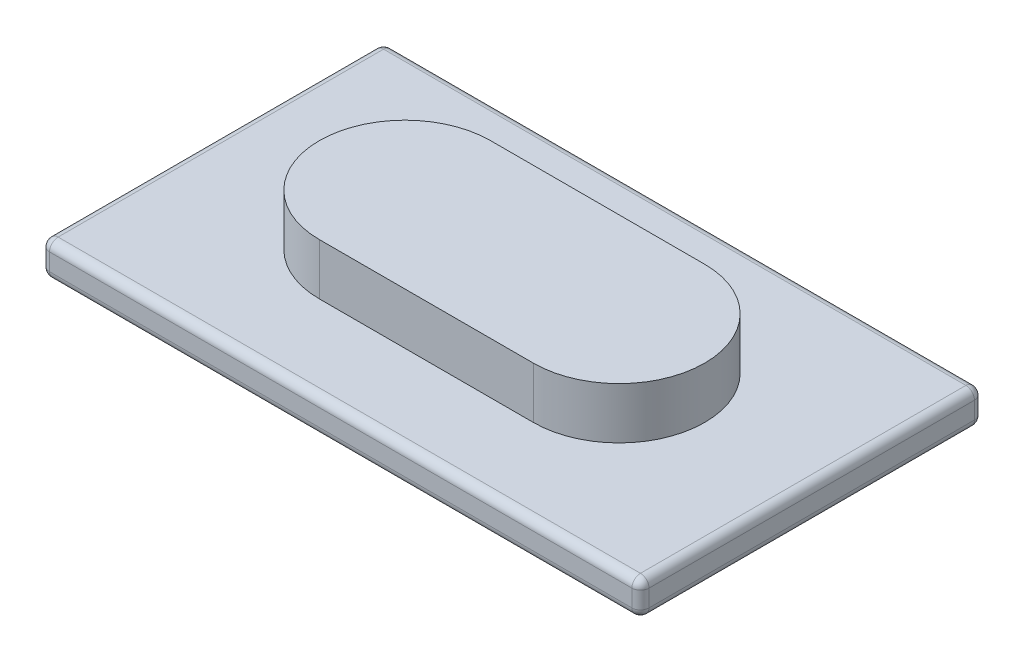
ISO-10303-21;
HEADER;
FILE_DESCRIPTION(('STEP AP214'),'2;1');
FILE_NAME('part.step','',(''),(''),'','','');
FILE_SCHEMA(('AUTOMOTIVE_DESIGN { 1 0 10303 214 1 1 1 1 }'));
ENDSEC;
DATA;
#1=APPLICATION_CONTEXT('core data for automotive mechanical design processes');
#2=APPLICATION_PROTOCOL_DEFINITION('international standard','automotive_design',2000,#1);
#3=PRODUCT_CONTEXT('',#1,'mechanical');
#4=PRODUCT('Part','Part','',(#3));
#5=PRODUCT_RELATED_PRODUCT_CATEGORY('part','',(#4));
#6=PRODUCT_DEFINITION_FORMATION('','',#4);
#7=PRODUCT_DEFINITION_CONTEXT('part definition',#1,'design');
#8=PRODUCT_DEFINITION('design','',#6,#7);
#9=PRODUCT_DEFINITION_SHAPE('','',#8);
#10=(LENGTH_UNIT() NAMED_UNIT(*) SI_UNIT(.MILLI.,.METRE.));
#11=(NAMED_UNIT(*) PLANE_ANGLE_UNIT() SI_UNIT($,.RADIAN.));
#12=(NAMED_UNIT(*) SI_UNIT($,.STERADIAN.) SOLID_ANGLE_UNIT());
#13=UNCERTAINTY_MEASURE_WITH_UNIT(LENGTH_MEASURE(1.E-05),#10,'distance_accuracy_value','');
#14=(GEOMETRIC_REPRESENTATION_CONTEXT(3) GLOBAL_UNCERTAINTY_ASSIGNED_CONTEXT((#13)) GLOBAL_UNIT_ASSIGNED_CONTEXT((#10,
#11,#12)) REPRESENTATION_CONTEXT('',''));
#15=CARTESIAN_POINT('',(0.,0.,0.));
#16=DIRECTION('',(0.,0.,1.));
#17=DIRECTION('',(1.,0.,0.));
#18=AXIS2_PLACEMENT_3D('',#15,#16,#17);
#19=CARTESIAN_POINT('',(-125.,40.,0.));
#20=DIRECTION('',(0.,-1.,0.));
#21=DIRECTION('',(0.,0.,-1.));
#22=AXIS2_PLACEMENT_3D('',#19,#20,#21);
#23=CYLINDRICAL_SURFACE('',#22,100.);
#24=DIRECTION('',(0.,-1.,0.));
#25=VECTOR('',#24,1.);
#26=CARTESIAN_POINT('',(-125.,100.,-100.));
#27=LINE('',#26,#25);
#28=CARTESIAN_POINT('',(-125.,40.,-100.));
#29=VERTEX_POINT('',#28);
#30=CARTESIAN_POINT('',(-125.,100.,-100.));
#31=VERTEX_POINT('',#30);
#32=EDGE_CURVE('E295',#29,#31,#27,.F.);
#33=ORIENTED_EDGE('',*,*,#32,.F.);
#34=CARTESIAN_POINT('',(-125.,40.,0.));
#35=DIRECTION('',(0.,1.,0.));
#36=DIRECTION('',(0.,0.,1.));
#37=AXIS2_PLACEMENT_3D('',#34,#35,#36);
#38=CIRCLE('',#37,100.);
#39=CARTESIAN_POINT('',(-125.,40.,100.));
#40=VERTEX_POINT('',#39);
#41=EDGE_CURVE('E11',#29,#40,#38,.T.);
#42=ORIENTED_EDGE('',*,*,#41,.T.);
#43=DIRECTION('',(0.,-1.,0.));
#44=VECTOR('',#43,1.);
#45=CARTESIAN_POINT('',(-125.,100.,100.));
#46=LINE('',#45,#44);
#47=CARTESIAN_POINT('',(-125.,100.,100.));
#48=VERTEX_POINT('',#47);
#49=EDGE_CURVE('E298',#48,#40,#46,.T.);
#50=ORIENTED_EDGE('',*,*,#49,.F.);
#51=CARTESIAN_POINT('',(-125.,100.,0.));
#52=DIRECTION('',(0.,1.,0.));
#53=DIRECTION('',(0.,0.,1.));
#54=AXIS2_PLACEMENT_3D('',#51,#52,#53);
#55=CIRCLE('',#54,100.);
#56=EDGE_CURVE('E45',#31,#48,#55,.T.);
#57=ORIENTED_EDGE('',*,*,#56,.F.);
#58=EDGE_LOOP('',(#33,#42,#50,#57));
#59=FACE_BOUND('',#58,.T.);
#60=ADVANCED_FACE('F37',(#59),#23,.T.);
#61=CARTESIAN_POINT('',(125.,40.,0.));
#62=DIRECTION('',(0.,-1.,0.));
#63=DIRECTION('',(0.,0.,-1.));
#64=AXIS2_PLACEMENT_3D('',#61,#62,#63);
#65=CYLINDRICAL_SURFACE('',#64,100.);
#66=DIRECTION('',(0.,-1.,0.));
#67=VECTOR('',#66,1.);
#68=CARTESIAN_POINT('',(125.,100.,100.));
#69=LINE('',#68,#67);
#70=CARTESIAN_POINT('',(125.,40.,100.));
#71=VERTEX_POINT('',#70);
#72=CARTESIAN_POINT('',(125.,100.,100.));
#73=VERTEX_POINT('',#72);
#74=EDGE_CURVE('E230',#71,#73,#69,.F.);
#75=ORIENTED_EDGE('',*,*,#74,.F.);
#76=CARTESIAN_POINT('',(125.,40.,0.));
#77=DIRECTION('',(0.,1.,0.));
#78=DIRECTION('',(0.,0.,1.));
#79=AXIS2_PLACEMENT_3D('',#76,#77,#78);
#80=CIRCLE('',#79,100.);
#81=CARTESIAN_POINT('',(125.,40.,-100.));
#82=VERTEX_POINT('',#81);
#83=EDGE_CURVE('E293',#71,#82,#80,.T.);
#84=ORIENTED_EDGE('',*,*,#83,.T.);
#85=DIRECTION('',(0.,-1.,0.));
#86=VECTOR('',#85,1.);
#87=CARTESIAN_POINT('',(125.,100.,-100.));
#88=LINE('',#87,#86);
#89=CARTESIAN_POINT('',(125.,100.,-100.));
#90=VERTEX_POINT('',#89);
#91=EDGE_CURVE('E288',#90,#82,#88,.T.);
#92=ORIENTED_EDGE('',*,*,#91,.F.);
#93=CARTESIAN_POINT('',(125.,100.,0.));
#94=DIRECTION('',(0.,1.,0.));
#95=DIRECTION('',(0.,0.,1.));
#96=AXIS2_PLACEMENT_3D('',#93,#94,#95);
#97=CIRCLE('',#96,100.);
#98=EDGE_CURVE('E291',#73,#90,#97,.T.);
#99=ORIENTED_EDGE('',*,*,#98,.F.);
#100=EDGE_LOOP('',(#75,#84,#92,#99));
#101=FACE_BOUND('',#100,.T.);
#102=ADVANCED_FACE('F320',(#101),#65,.T.);
#103=CARTESIAN_POINT('',(0.,40.,0.));
#104=DIRECTION('',(0.,1.,0.));
#105=DIRECTION('',(0.,0.,1.));
#106=AXIS2_PLACEMENT_3D('',#103,#104,#105);
#107=PLANE('',#106);
#108=DIRECTION('',(1.,0.,0.));
#109=VECTOR('',#108,1.);
#110=CARTESIAN_POINT('',(350.,40.,190.));
#111=LINE('',#110,#109);
#112=CARTESIAN_POINT('',(-340.,40.,190.));
#113=VERTEX_POINT('',#112);
#114=CARTESIAN_POINT('',(340.,40.,190.));
#115=VERTEX_POINT('',#114);
#116=EDGE_CURVE('E222',#113,#115,#111,.T.);
#117=ORIENTED_EDGE('',*,*,#116,.T.);
#118=DIRECTION('',(0.,0.,-1.));
#119=VECTOR('',#118,1.);
#120=CARTESIAN_POINT('',(340.,40.,-200.));
#121=LINE('',#120,#119);
#122=CARTESIAN_POINT('',(340.,40.,-190.));
#123=VERTEX_POINT('',#122);
#124=EDGE_CURVE('E228',#115,#123,#121,.T.);
#125=ORIENTED_EDGE('',*,*,#124,.T.);
#126=DIRECTION('',(-1.,0.,0.));
#127=VECTOR('',#126,1.);
#128=CARTESIAN_POINT('',(-350.,40.,-190.));
#129=LINE('',#128,#127);
#130=CARTESIAN_POINT('',(-340.,40.,-190.));
#131=VERTEX_POINT('',#130);
#132=EDGE_CURVE('E226',#123,#131,#129,.T.);
#133=ORIENTED_EDGE('',*,*,#132,.T.);
#134=DIRECTION('',(0.,0.,1.));
#135=VECTOR('',#134,1.);
#136=CARTESIAN_POINT('',(-340.,40.,200.));
#137=LINE('',#136,#135);
#138=EDGE_CURVE('E224',#131,#113,#137,.T.);
#139=ORIENTED_EDGE('',*,*,#138,.T.);
#140=EDGE_LOOP('',(#117,#125,#133,#139));
#141=FACE_BOUND('',#140,.T.);
#142=DIRECTION('',(-1.,0.,0.));
#143=VECTOR('',#142,1.);
#144=CARTESIAN_POINT('',(-225.,40.,-100.));
#145=LINE('',#144,#143);
#146=EDGE_CURVE('E310',#82,#29,#145,.T.);
#147=ORIENTED_EDGE('',*,*,#146,.F.);
#148=ORIENTED_EDGE('',*,*,#83,.F.);
#149=DIRECTION('',(1.,0.,0.));
#150=VECTOR('',#149,1.);
#151=CARTESIAN_POINT('',(-225.,40.,100.));
#152=LINE('',#151,#150);
#153=EDGE_CURVE('E303',#40,#71,#152,.T.);
#154=ORIENTED_EDGE('',*,*,#153,.F.);
#155=ORIENTED_EDGE('',*,*,#41,.F.);
#156=EDGE_LOOP('',(#147,#148,#154,#155));
#157=FACE_BOUND('',#156,.T.);
#158=ADVANCED_FACE('F307',(#141,#157),#107,.T.);
#159=CARTESIAN_POINT('',(350.,40.,-200.));
#160=DIRECTION('',(-1.,0.,0.));
#161=DIRECTION('',(0.,0.,1.));
#162=AXIS2_PLACEMENT_3D('',#159,#160,#161);
#163=PLANE('',#162);
#164=DIRECTION('',(0.,0.,-1.));
#165=VECTOR('',#164,1.);
#166=CARTESIAN_POINT('',(350.,30.,200.));
#167=LINE('',#166,#165);
#168=CARTESIAN_POINT('',(350.,30.,-190.));
#169=VERTEX_POINT('',#168);
#170=CARTESIAN_POINT('',(350.,30.,190.));
#171=VERTEX_POINT('',#170);
#172=EDGE_CURVE('E177',#169,#171,#167,.F.);
#173=ORIENTED_EDGE('',*,*,#172,.T.);
#174=DIRECTION('',(0.,-1.,0.));
#175=VECTOR('',#174,1.);
#176=CARTESIAN_POINT('',(350.,40.,190.));
#177=LINE('',#176,#175);
#178=CARTESIAN_POINT('',(350.,10.,190.));
#179=VERTEX_POINT('',#178);
#180=EDGE_CURVE('E182',#171,#179,#177,.T.);
#181=ORIENTED_EDGE('',*,*,#180,.T.);
#182=DIRECTION('',(0.,0.,-1.));
#183=VECTOR('',#182,1.);
#184=CARTESIAN_POINT('',(350.,10.,-200.));
#185=LINE('',#184,#183);
#186=CARTESIAN_POINT('',(350.,10.,-190.));
#187=VERTEX_POINT('',#186);
#188=EDGE_CURVE('E152',#179,#187,#185,.T.);
#189=ORIENTED_EDGE('',*,*,#188,.T.);
#190=DIRECTION('',(0.,-1.,0.));
#191=VECTOR('',#190,1.);
#192=CARTESIAN_POINT('',(350.,40.,-190.));
#193=LINE('',#192,#191);
#194=EDGE_CURVE('E171',#187,#169,#193,.F.);
#195=ORIENTED_EDGE('',*,*,#194,.T.);
#196=EDGE_LOOP('',(#173,#181,#189,#195));
#197=FACE_BOUND('',#196,.T.);
#198=ADVANCED_FACE('F180',(#197),#163,.F.);
#199=CARTESIAN_POINT('',(-350.,40.,-200.));
#200=DIRECTION('',(0.,0.,1.));
#201=DIRECTION('',(1.,0.,0.));
#202=AXIS2_PLACEMENT_3D('',#199,#200,#201);
#203=PLANE('',#202);
#204=DIRECTION('',(-1.,0.,0.));
#205=VECTOR('',#204,1.);
#206=CARTESIAN_POINT('',(-350.,10.,-200.));
#207=LINE('',#206,#205);
#208=CARTESIAN_POINT('',(340.,10.,-200.));
#209=VERTEX_POINT('',#208);
#210=CARTESIAN_POINT('',(-340.,10.,-200.));
#211=VERTEX_POINT('',#210);
#212=EDGE_CURVE('E199',#209,#211,#207,.T.);
#213=ORIENTED_EDGE('',*,*,#212,.T.);
#214=DIRECTION('',(0.,-1.,0.));
#215=VECTOR('',#214,1.);
#216=CARTESIAN_POINT('',(-340.,40.,-200.));
#217=LINE('',#216,#215);
#218=CARTESIAN_POINT('',(-340.,30.,-200.));
#219=VERTEX_POINT('',#218);
#220=EDGE_CURVE('E202',#211,#219,#217,.F.);
#221=ORIENTED_EDGE('',*,*,#220,.T.);
#222=DIRECTION('',(-1.,0.,0.));
#223=VECTOR('',#222,1.);
#224=CARTESIAN_POINT('',(350.,30.,-200.));
#225=LINE('',#224,#223);
#226=CARTESIAN_POINT('',(340.,30.,-200.));
#227=VERTEX_POINT('',#226);
#228=EDGE_CURVE('E197',#219,#227,#225,.F.);
#229=ORIENTED_EDGE('',*,*,#228,.T.);
#230=DIRECTION('',(0.,-1.,0.));
#231=VECTOR('',#230,1.);
#232=CARTESIAN_POINT('',(340.,40.,-200.));
#233=LINE('',#232,#231);
#234=EDGE_CURVE('E195',#227,#209,#233,.T.);
#235=ORIENTED_EDGE('',*,*,#234,.T.);
#236=EDGE_LOOP('',(#213,#221,#229,#235));
#237=FACE_BOUND('',#236,.T.);
#238=ADVANCED_FACE('F414',(#237),#203,.F.);
#239=CARTESIAN_POINT('',(-350.,40.,-200.));
#240=DIRECTION('',(1.,0.,0.));
#241=DIRECTION('',(0.,0.,-1.));
#242=AXIS2_PLACEMENT_3D('',#239,#240,#241);
#243=PLANE('',#242);
#244=DIRECTION('',(0.,0.,1.));
#245=VECTOR('',#244,1.);
#246=CARTESIAN_POINT('',(-350.,30.,-200.));
#247=LINE('',#246,#245);
#248=CARTESIAN_POINT('',(-350.,30.,190.));
#249=VERTEX_POINT('',#248);
#250=CARTESIAN_POINT('',(-350.,30.,-190.));
#251=VERTEX_POINT('',#250);
#252=EDGE_CURVE('E206',#249,#251,#247,.F.);
#253=ORIENTED_EDGE('',*,*,#252,.T.);
#254=DIRECTION('',(0.,-1.,0.));
#255=VECTOR('',#254,1.);
#256=CARTESIAN_POINT('',(-350.,40.,-190.));
#257=LINE('',#256,#255);
#258=CARTESIAN_POINT('',(-350.,10.,-190.));
#259=VERTEX_POINT('',#258);
#260=EDGE_CURVE('E211',#251,#259,#257,.T.);
#261=ORIENTED_EDGE('',*,*,#260,.T.);
#262=DIRECTION('',(0.,0.,1.));
#263=VECTOR('',#262,1.);
#264=CARTESIAN_POINT('',(-350.,10.,-200.));
#265=LINE('',#264,#263);
#266=CARTESIAN_POINT('',(-350.,10.,190.));
#267=VERTEX_POINT('',#266);
#268=EDGE_CURVE('E208',#259,#267,#265,.T.);
#269=ORIENTED_EDGE('',*,*,#268,.T.);
#270=DIRECTION('',(0.,-1.,0.));
#271=VECTOR('',#270,1.);
#272=CARTESIAN_POINT('',(-350.,40.,190.));
#273=LINE('',#272,#271);
#274=EDGE_CURVE('E204',#267,#249,#273,.F.);
#275=ORIENTED_EDGE('',*,*,#274,.T.);
#276=EDGE_LOOP('',(#253,#261,#269,#275));
#277=FACE_BOUND('',#276,.T.);
#278=ADVANCED_FACE('F417',(#277),#243,.F.);
#279=CARTESIAN_POINT('',(-350.,40.,200.));
#280=DIRECTION('',(0.,0.,-1.));
#281=DIRECTION('',(-1.,0.,0.));
#282=AXIS2_PLACEMENT_3D('',#279,#280,#281);
#283=PLANE('',#282);
#284=DIRECTION('',(1.,0.,0.));
#285=VECTOR('',#284,1.);
#286=CARTESIAN_POINT('',(-350.,10.,200.));
#287=LINE('',#286,#285);
#288=CARTESIAN_POINT('',(-340.,10.,200.));
#289=VERTEX_POINT('',#288);
#290=CARTESIAN_POINT('',(340.,10.,200.));
#291=VERTEX_POINT('',#290);
#292=EDGE_CURVE('E217',#289,#291,#287,.T.);
#293=ORIENTED_EDGE('',*,*,#292,.T.);
#294=DIRECTION('',(0.,-1.,0.));
#295=VECTOR('',#294,1.);
#296=CARTESIAN_POINT('',(340.,40.,200.));
#297=LINE('',#296,#295);
#298=CARTESIAN_POINT('',(340.,30.,200.));
#299=VERTEX_POINT('',#298);
#300=EDGE_CURVE('E220',#291,#299,#297,.F.);
#301=ORIENTED_EDGE('',*,*,#300,.T.);
#302=DIRECTION('',(1.,0.,0.));
#303=VECTOR('',#302,1.);
#304=CARTESIAN_POINT('',(-350.,30.,200.));
#305=LINE('',#304,#303);
#306=CARTESIAN_POINT('',(-340.,30.,200.));
#307=VERTEX_POINT('',#306);
#308=EDGE_CURVE('E215',#299,#307,#305,.F.);
#309=ORIENTED_EDGE('',*,*,#308,.T.);
#310=DIRECTION('',(0.,-1.,0.));
#311=VECTOR('',#310,1.);
#312=CARTESIAN_POINT('',(-340.,40.,200.));
#313=LINE('',#312,#311);
#314=EDGE_CURVE('E213',#307,#289,#313,.T.);
#315=ORIENTED_EDGE('',*,*,#314,.T.);
#316=EDGE_LOOP('',(#293,#301,#309,#315));
#317=FACE_BOUND('',#316,.T.);
#318=ADVANCED_FACE('F421',(#317),#283,.F.);
#319=CARTESIAN_POINT('',(0.,0.,0.));
#320=DIRECTION('',(0.,1.,0.));
#321=DIRECTION('',(0.,0.,1.));
#322=AXIS2_PLACEMENT_3D('',#319,#320,#321);
#323=PLANE('',#322);
#324=DIRECTION('',(-1.,0.,0.));
#325=VECTOR('',#324,1.);
#326=CARTESIAN_POINT('',(0.,0.,-190.));
#327=LINE('',#326,#325);
#328=CARTESIAN_POINT('',(-340.,0.,-190.));
#329=VERTEX_POINT('',#328);
#330=CARTESIAN_POINT('',(340.,0.,-190.));
#331=VERTEX_POINT('',#330);
#332=EDGE_CURVE('E192',#329,#331,#327,.F.);
#333=ORIENTED_EDGE('',*,*,#332,.T.);
#334=DIRECTION('',(0.,0.,-1.));
#335=VECTOR('',#334,1.);
#336=CARTESIAN_POINT('',(340.,0.,0.));
#337=LINE('',#336,#335);
#338=CARTESIAN_POINT('',(340.,0.,190.));
#339=VERTEX_POINT('',#338);
#340=EDGE_CURVE('E154',#331,#339,#337,.F.);
#341=ORIENTED_EDGE('',*,*,#340,.T.);
#342=DIRECTION('',(1.,0.,0.));
#343=VECTOR('',#342,1.);
#344=CARTESIAN_POINT('',(0.,0.,190.));
#345=LINE('',#344,#343);
#346=CARTESIAN_POINT('',(-340.,0.,190.));
#347=VERTEX_POINT('',#346);
#348=EDGE_CURVE('E185',#339,#347,#345,.F.);
#349=ORIENTED_EDGE('',*,*,#348,.T.);
#350=DIRECTION('',(0.,0.,1.));
#351=VECTOR('',#350,1.);
#352=CARTESIAN_POINT('',(-340.,0.,0.));
#353=LINE('',#352,#351);
#354=EDGE_CURVE('E190',#347,#329,#353,.F.);
#355=ORIENTED_EDGE('',*,*,#354,.T.);
#356=EDGE_LOOP('',(#333,#341,#349,#355));
#357=FACE_BOUND('',#356,.T.);
#358=ADVANCED_FACE('F341',(#357),#323,.F.);
#359=CARTESIAN_POINT('',(-340.,30.,0.));
#360=DIRECTION('',(0.,0.,-1.));
#361=DIRECTION('',(-1.,0.,0.));
#362=AXIS2_PLACEMENT_3D('',#359,#360,#361);
#363=CYLINDRICAL_SURFACE('',#362,10.);
#364=CARTESIAN_POINT('',(-340.,30.,190.));
#365=DIRECTION('',(0.,0.,1.));
#366=DIRECTION('',(1.,0.,0.));
#367=AXIS2_PLACEMENT_3D('',#364,#365,#366);
#368=CIRCLE('',#367,10.);
#369=EDGE_CURVE('E178',#113,#249,#368,.T.);
#370=ORIENTED_EDGE('',*,*,#369,.F.);
#371=ORIENTED_EDGE('',*,*,#138,.F.);
#372=CARTESIAN_POINT('',(-340.,30.,-190.));
#373=DIRECTION('',(0.,0.,-1.));
#374=DIRECTION('',(-1.,0.,0.));
#375=AXIS2_PLACEMENT_3D('',#372,#373,#374);
#376=CIRCLE('',#375,10.);
#377=EDGE_CURVE('E281',#251,#131,#376,.T.);
#378=ORIENTED_EDGE('',*,*,#377,.F.);
#379=ORIENTED_EDGE('',*,*,#252,.F.);
#380=EDGE_LOOP('',(#370,#371,#378,#379));
#381=FACE_BOUND('',#380,.T.);
#382=ADVANCED_FACE('F337',(#381),#363,.T.);
#383=CARTESIAN_POINT('',(-340.,30.,190.));
#384=DIRECTION('',(0.,0.,1.));
#385=DIRECTION('',(1.,0.,0.));
#386=AXIS2_PLACEMENT_3D('',#383,#384,#385);
#387=SPHERICAL_SURFACE('',#386,10.);
#388=CARTESIAN_POINT('',(-340.,30.,190.));
#389=DIRECTION('',(-1.,0.,0.));
#390=DIRECTION('',(0.,0.,1.));
#391=AXIS2_PLACEMENT_3D('',#388,#389,#390);
#392=CIRCLE('',#391,10.);
#393=EDGE_CURVE('E275',#113,#307,#392,.F.);
#394=ORIENTED_EDGE('',*,*,#393,.F.);
#395=ORIENTED_EDGE('',*,*,#369,.T.);
#396=CARTESIAN_POINT('',(-340.,30.,190.));
#397=DIRECTION('',(0.,1.,0.));
#398=DIRECTION('',(0.,0.,1.));
#399=AXIS2_PLACEMENT_3D('',#396,#397,#398);
#400=CIRCLE('',#399,10.);
#401=EDGE_CURVE('E278',#307,#249,#400,.F.);
#402=ORIENTED_EDGE('',*,*,#401,.F.);
#403=EDGE_LOOP('',(#394,#395,#402));
#404=FACE_BOUND('',#403,.T.);
#405=ADVANCED_FACE('F340',(#404),#387,.T.);
#406=CARTESIAN_POINT('',(-340.,30.,-190.));
#407=DIRECTION('',(0.,0.,1.));
#408=DIRECTION('',(1.,0.,0.));
#409=AXIS2_PLACEMENT_3D('',#406,#407,#408);
#410=SPHERICAL_SURFACE('',#409,10.);
#411=CARTESIAN_POINT('',(-340.,30.,-190.));
#412=DIRECTION('',(0.,1.,0.));
#413=DIRECTION('',(0.,0.,1.));
#414=AXIS2_PLACEMENT_3D('',#411,#412,#413);
#415=CIRCLE('',#414,10.);
#416=EDGE_CURVE('E269',#251,#219,#415,.F.);
#417=ORIENTED_EDGE('',*,*,#416,.F.);
#418=ORIENTED_EDGE('',*,*,#377,.T.);
#419=CARTESIAN_POINT('',(-340.,30.,-190.));
#420=DIRECTION('',(-1.,0.,0.));
#421=DIRECTION('',(0.,0.,1.));
#422=AXIS2_PLACEMENT_3D('',#419,#420,#421);
#423=CIRCLE('',#422,10.);
#424=EDGE_CURVE('E272',#219,#131,#423,.F.);
#425=ORIENTED_EDGE('',*,*,#424,.F.);
#426=EDGE_LOOP('',(#417,#418,#425));
#427=FACE_BOUND('',#426,.T.);
#428=ADVANCED_FACE('F345',(#427),#410,.T.);
#429=CARTESIAN_POINT('',(-340.,40.,190.));
#430=DIRECTION('',(0.,-1.,0.));
#431=DIRECTION('',(0.,0.,-1.));
#432=AXIS2_PLACEMENT_3D('',#429,#430,#431);
#433=CYLINDRICAL_SURFACE('',#432,10.);
#434=ORIENTED_EDGE('',*,*,#401,.T.);
#435=ORIENTED_EDGE('',*,*,#274,.F.);
#436=CARTESIAN_POINT('',(-340.,10.,190.));
#437=DIRECTION('',(0.,-1.,0.));
#438=DIRECTION('',(0.,0.,-1.));
#439=AXIS2_PLACEMENT_3D('',#436,#437,#438);
#440=CIRCLE('',#439,10.);
#441=EDGE_CURVE('E264',#289,#267,#440,.T.);
#442=ORIENTED_EDGE('',*,*,#441,.F.);
#443=ORIENTED_EDGE('',*,*,#314,.F.);
#444=EDGE_LOOP('',(#434,#435,#442,#443));
#445=FACE_BOUND('',#444,.T.);
#446=ADVANCED_FACE('F349',(#445),#433,.T.);
#447=CARTESIAN_POINT('',(0.,30.,190.));
#448=DIRECTION('',(-1.,0.,0.));
#449=DIRECTION('',(0.,0.,1.));
#450=AXIS2_PLACEMENT_3D('',#447,#448,#449);
#451=CYLINDRICAL_SURFACE('',#450,10.);
#452=ORIENTED_EDGE('',*,*,#393,.T.);
#453=ORIENTED_EDGE('',*,*,#308,.F.);
#454=CARTESIAN_POINT('',(340.,30.,190.));
#455=DIRECTION('',(1.,0.,0.));
#456=DIRECTION('',(0.,0.,-1.));
#457=AXIS2_PLACEMENT_3D('',#454,#455,#456);
#458=CIRCLE('',#457,10.);
#459=EDGE_CURVE('E261',#115,#299,#458,.T.);
#460=ORIENTED_EDGE('',*,*,#459,.F.);
#461=ORIENTED_EDGE('',*,*,#116,.F.);
#462=EDGE_LOOP('',(#452,#453,#460,#461));
#463=FACE_BOUND('',#462,.T.);
#464=ADVANCED_FACE('F353',(#463),#451,.T.);
#465=CARTESIAN_POINT('',(340.,30.,0.));
#466=DIRECTION('',(0.,0.,1.));
#467=DIRECTION('',(1.,0.,0.));
#468=AXIS2_PLACEMENT_3D('',#465,#466,#467);
#469=CYLINDRICAL_SURFACE('',#468,10.);
#470=CARTESIAN_POINT('',(340.,30.,-190.));
#471=DIRECTION('',(0.,0.,-1.));
#472=DIRECTION('',(-1.,0.,0.));
#473=AXIS2_PLACEMENT_3D('',#470,#471,#472);
#474=CIRCLE('',#473,10.);
#475=EDGE_CURVE('E255',#123,#169,#474,.T.);
#476=ORIENTED_EDGE('',*,*,#475,.F.);
#477=ORIENTED_EDGE('',*,*,#124,.F.);
#478=CARTESIAN_POINT('',(340.,30.,190.));
#479=DIRECTION('',(0.,0.,1.));
#480=DIRECTION('',(1.,0.,0.));
#481=AXIS2_PLACEMENT_3D('',#478,#479,#480);
#482=CIRCLE('',#481,10.);
#483=EDGE_CURVE('E258',#171,#115,#482,.T.);
#484=ORIENTED_EDGE('',*,*,#483,.F.);
#485=ORIENTED_EDGE('',*,*,#172,.F.);
#486=EDGE_LOOP('',(#476,#477,#484,#485));
#487=FACE_BOUND('',#486,.T.);
#488=ADVANCED_FACE('F357',(#487),#469,.T.);
#489=CARTESIAN_POINT('',(0.,30.,-190.));
#490=DIRECTION('',(1.,0.,0.));
#491=DIRECTION('',(0.,0.,-1.));
#492=AXIS2_PLACEMENT_3D('',#489,#490,#491);
#493=CYLINDRICAL_SURFACE('',#492,10.);
#494=ORIENTED_EDGE('',*,*,#424,.T.);
#495=ORIENTED_EDGE('',*,*,#132,.F.);
#496=CARTESIAN_POINT('',(340.,30.,-190.));
#497=DIRECTION('',(1.,0.,0.));
#498=DIRECTION('',(0.,0.,-1.));
#499=AXIS2_PLACEMENT_3D('',#496,#497,#498);
#500=CIRCLE('',#499,10.);
#501=EDGE_CURVE('E253',#227,#123,#500,.T.);
#502=ORIENTED_EDGE('',*,*,#501,.F.);
#503=ORIENTED_EDGE('',*,*,#228,.F.);
#504=EDGE_LOOP('',(#494,#495,#502,#503));
#505=FACE_BOUND('',#504,.T.);
#506=ADVANCED_FACE('F361',(#505),#493,.T.);
#507=CARTESIAN_POINT('',(-340.,40.,-190.));
#508=DIRECTION('',(0.,-1.,0.));
#509=DIRECTION('',(0.,0.,-1.));
#510=AXIS2_PLACEMENT_3D('',#507,#508,#509);
#511=CYLINDRICAL_SURFACE('',#510,10.);
#512=ORIENTED_EDGE('',*,*,#416,.T.);
#513=ORIENTED_EDGE('',*,*,#220,.F.);
#514=CARTESIAN_POINT('',(-340.,10.,-190.));
#515=DIRECTION('',(0.,-1.,0.));
#516=DIRECTION('',(0.,0.,-1.));
#517=AXIS2_PLACEMENT_3D('',#514,#515,#516);
#518=CIRCLE('',#517,10.);
#519=EDGE_CURVE('E250',#259,#211,#518,.T.);
#520=ORIENTED_EDGE('',*,*,#519,.F.);
#521=ORIENTED_EDGE('',*,*,#260,.F.);
#522=EDGE_LOOP('',(#512,#513,#520,#521));
#523=FACE_BOUND('',#522,.T.);
#524=ADVANCED_FACE('F365',(#523),#511,.T.);
#525=CARTESIAN_POINT('',(-340.,10.,-200.));
#526=DIRECTION('',(0.,0.,1.));
#527=DIRECTION('',(1.,0.,0.));
#528=AXIS2_PLACEMENT_3D('',#525,#526,#527);
#529=CYLINDRICAL_SURFACE('',#528,10.);
#530=CARTESIAN_POINT('',(-340.,10.,190.));
#531=DIRECTION('',(0.,0.,1.));
#532=DIRECTION('',(1.,0.,0.));
#533=AXIS2_PLACEMENT_3D('',#530,#531,#532);
#534=CIRCLE('',#533,10.);
#535=EDGE_CURVE('E266',#267,#347,#534,.T.);
#536=ORIENTED_EDGE('',*,*,#535,.F.);
#537=ORIENTED_EDGE('',*,*,#268,.F.);
#538=CARTESIAN_POINT('',(-340.,10.,-190.));
#539=DIRECTION('',(0.,0.,-1.));
#540=DIRECTION('',(-1.,0.,0.));
#541=AXIS2_PLACEMENT_3D('',#538,#539,#540);
#542=CIRCLE('',#541,10.);
#543=EDGE_CURVE('E247',#329,#259,#542,.T.);
#544=ORIENTED_EDGE('',*,*,#543,.F.);
#545=ORIENTED_EDGE('',*,*,#354,.F.);
#546=EDGE_LOOP('',(#536,#537,#544,#545));
#547=FACE_BOUND('',#546,.T.);
#548=ADVANCED_FACE('F369',(#547),#529,.T.);
#549=CARTESIAN_POINT('',(-340.,10.,190.));
#550=DIRECTION('',(0.,0.,1.));
#551=DIRECTION('',(1.,0.,0.));
#552=AXIS2_PLACEMENT_3D('',#549,#550,#551);
#553=SPHERICAL_SURFACE('',#552,10.);
#554=ORIENTED_EDGE('',*,*,#441,.T.);
#555=ORIENTED_EDGE('',*,*,#535,.T.);
#556=CARTESIAN_POINT('',(-340.,10.,190.));
#557=DIRECTION('',(-1.,0.,0.));
#558=DIRECTION('',(0.,0.,1.));
#559=AXIS2_PLACEMENT_3D('',#556,#557,#558);
#560=CIRCLE('',#559,10.);
#561=EDGE_CURVE('E244',#289,#347,#560,.F.);
#562=ORIENTED_EDGE('',*,*,#561,.F.);
#563=EDGE_LOOP('',(#554,#555,#562));
#564=FACE_BOUND('',#563,.T.);
#565=ADVANCED_FACE('F373',(#564),#553,.T.);
#566=CARTESIAN_POINT('',(340.,30.,190.));
#567=DIRECTION('',(0.,0.,1.));
#568=DIRECTION('',(1.,0.,0.));
#569=AXIS2_PLACEMENT_3D('',#566,#567,#568);
#570=SPHERICAL_SURFACE('',#569,10.);
#571=ORIENTED_EDGE('',*,*,#483,.T.);
#572=ORIENTED_EDGE('',*,*,#459,.T.);
#573=CARTESIAN_POINT('',(340.,30.,190.));
#574=DIRECTION('',(0.,1.,0.));
#575=DIRECTION('',(0.,0.,1.));
#576=AXIS2_PLACEMENT_3D('',#573,#574,#575);
#577=CIRCLE('',#576,10.);
#578=EDGE_CURVE('E241',#171,#299,#577,.F.);
#579=ORIENTED_EDGE('',*,*,#578,.F.);
#580=EDGE_LOOP('',(#571,#572,#579));
#581=FACE_BOUND('',#580,.T.);
#582=ADVANCED_FACE('F377',(#581),#570,.T.);
#583=CARTESIAN_POINT('',(340.,30.,-190.));
#584=DIRECTION('',(0.,0.,1.));
#585=DIRECTION('',(1.,0.,0.));
#586=AXIS2_PLACEMENT_3D('',#583,#584,#585);
#587=SPHERICAL_SURFACE('',#586,10.);
#588=ORIENTED_EDGE('',*,*,#501,.T.);
#589=ORIENTED_EDGE('',*,*,#475,.T.);
#590=CARTESIAN_POINT('',(340.,30.,-190.));
#591=DIRECTION('',(0.,1.,0.));
#592=DIRECTION('',(0.,0.,1.));
#593=AXIS2_PLACEMENT_3D('',#590,#591,#592);
#594=CIRCLE('',#593,10.);
#595=EDGE_CURVE('E174',#227,#169,#594,.F.);
#596=ORIENTED_EDGE('',*,*,#595,.F.);
#597=EDGE_LOOP('',(#588,#589,#596));
#598=FACE_BOUND('',#597,.T.);
#599=ADVANCED_FACE('F381',(#598),#587,.T.);
#600=CARTESIAN_POINT('',(-340.,10.,-190.));
#601=DIRECTION('',(0.,0.,1.));
#602=DIRECTION('',(1.,0.,0.));
#603=AXIS2_PLACEMENT_3D('',#600,#601,#602);
#604=SPHERICAL_SURFACE('',#603,10.);
#605=ORIENTED_EDGE('',*,*,#543,.T.);
#606=ORIENTED_EDGE('',*,*,#519,.T.);
#607=CARTESIAN_POINT('',(-340.,10.,-190.));
#608=DIRECTION('',(-1.,0.,0.));
#609=DIRECTION('',(0.,0.,1.));
#610=AXIS2_PLACEMENT_3D('',#607,#608,#609);
#611=CIRCLE('',#610,10.);
#612=EDGE_CURVE('E238',#329,#211,#611,.F.);
#613=ORIENTED_EDGE('',*,*,#612,.F.);
#614=EDGE_LOOP('',(#605,#606,#613));
#615=FACE_BOUND('',#614,.T.);
#616=ADVANCED_FACE('F385',(#615),#604,.T.);
#617=CARTESIAN_POINT('',(-350.,10.,190.));
#618=DIRECTION('',(1.,0.,0.));
#619=DIRECTION('',(0.,0.,-1.));
#620=AXIS2_PLACEMENT_3D('',#617,#618,#619);
#621=CYLINDRICAL_SURFACE('',#620,10.);
#622=ORIENTED_EDGE('',*,*,#561,.T.);
#623=ORIENTED_EDGE('',*,*,#348,.F.);
#624=CARTESIAN_POINT('',(340.,10.,190.));
#625=DIRECTION('',(1.,0.,0.));
#626=DIRECTION('',(0.,0.,-1.));
#627=AXIS2_PLACEMENT_3D('',#624,#625,#626);
#628=CIRCLE('',#627,10.);
#629=EDGE_CURVE('E235',#291,#339,#628,.T.);
#630=ORIENTED_EDGE('',*,*,#629,.F.);
#631=ORIENTED_EDGE('',*,*,#292,.F.);
#632=EDGE_LOOP('',(#622,#623,#630,#631));
#633=FACE_BOUND('',#632,.T.);
#634=ADVANCED_FACE('F389',(#633),#621,.T.);
#635=CARTESIAN_POINT('',(340.,40.,190.));
#636=DIRECTION('',(0.,-1.,0.));
#637=DIRECTION('',(0.,0.,-1.));
#638=AXIS2_PLACEMENT_3D('',#635,#636,#637);
#639=CYLINDRICAL_SURFACE('',#638,10.);
#640=ORIENTED_EDGE('',*,*,#578,.T.);
#641=ORIENTED_EDGE('',*,*,#300,.F.);
#642=CARTESIAN_POINT('',(340.,10.,190.));
#643=DIRECTION('',(0.,-1.,0.));
#644=DIRECTION('',(0.,0.,-1.));
#645=AXIS2_PLACEMENT_3D('',#642,#643,#644);
#646=CIRCLE('',#645,10.);
#647=EDGE_CURVE('E168',#179,#291,#646,.T.);
#648=ORIENTED_EDGE('',*,*,#647,.F.);
#649=ORIENTED_EDGE('',*,*,#180,.F.);
#650=EDGE_LOOP('',(#640,#641,#648,#649));
#651=FACE_BOUND('',#650,.T.);
#652=ADVANCED_FACE('F393',(#651),#639,.T.);
#653=CARTESIAN_POINT('',(340.,40.,-190.));
#654=DIRECTION('',(0.,-1.,0.));
#655=DIRECTION('',(0.,0.,-1.));
#656=AXIS2_PLACEMENT_3D('',#653,#654,#655);
#657=CYLINDRICAL_SURFACE('',#656,10.);
#658=ORIENTED_EDGE('',*,*,#595,.T.);
#659=ORIENTED_EDGE('',*,*,#194,.F.);
#660=CARTESIAN_POINT('',(340.,10.,-190.));
#661=DIRECTION('',(0.,-1.,0.));
#662=DIRECTION('',(0.,0.,-1.));
#663=AXIS2_PLACEMENT_3D('',#660,#661,#662);
#664=CIRCLE('',#663,10.);
#665=EDGE_CURVE('E161',#209,#187,#664,.T.);
#666=ORIENTED_EDGE('',*,*,#665,.F.);
#667=ORIENTED_EDGE('',*,*,#234,.F.);
#668=EDGE_LOOP('',(#658,#659,#666,#667));
#669=FACE_BOUND('',#668,.T.);
#670=ADVANCED_FACE('F172',(#669),#657,.T.);
#671=CARTESIAN_POINT('',(-350.,10.,-190.));
#672=DIRECTION('',(-1.,0.,0.));
#673=DIRECTION('',(0.,0.,1.));
#674=AXIS2_PLACEMENT_3D('',#671,#672,#673);
#675=CYLINDRICAL_SURFACE('',#674,10.);
#676=ORIENTED_EDGE('',*,*,#612,.T.);
#677=ORIENTED_EDGE('',*,*,#212,.F.);
#678=CARTESIAN_POINT('',(340.,10.,-190.));
#679=DIRECTION('',(1.,0.,0.));
#680=DIRECTION('',(0.,0.,-1.));
#681=AXIS2_PLACEMENT_3D('',#678,#679,#680);
#682=CIRCLE('',#681,10.);
#683=EDGE_CURVE('E165',#331,#209,#682,.T.);
#684=ORIENTED_EDGE('',*,*,#683,.F.);
#685=ORIENTED_EDGE('',*,*,#332,.F.);
#686=EDGE_LOOP('',(#676,#677,#684,#685));
#687=FACE_BOUND('',#686,.T.);
#688=ADVANCED_FACE('F400',(#687),#675,.T.);
#689=CARTESIAN_POINT('',(340.,10.,190.));
#690=DIRECTION('',(0.,0.,1.));
#691=DIRECTION('',(1.,0.,0.));
#692=AXIS2_PLACEMENT_3D('',#689,#690,#691);
#693=SPHERICAL_SURFACE('',#692,10.);
#694=ORIENTED_EDGE('',*,*,#647,.T.);
#695=ORIENTED_EDGE('',*,*,#629,.T.);
#696=CARTESIAN_POINT('',(340.,10.,190.));
#697=DIRECTION('',(0.,0.,1.));
#698=DIRECTION('',(1.,0.,0.));
#699=AXIS2_PLACEMENT_3D('',#696,#697,#698);
#700=CIRCLE('',#699,10.);
#701=EDGE_CURVE('E157',#179,#339,#700,.F.);
#702=ORIENTED_EDGE('',*,*,#701,.F.);
#703=EDGE_LOOP('',(#694,#695,#702));
#704=FACE_BOUND('',#703,.T.);
#705=ADVANCED_FACE('F403',(#704),#693,.T.);
#706=CARTESIAN_POINT('',(340.,10.,-190.));
#707=DIRECTION('',(0.,0.,1.));
#708=DIRECTION('',(1.,0.,0.));
#709=AXIS2_PLACEMENT_3D('',#706,#707,#708);
#710=SPHERICAL_SURFACE('',#709,10.);
#711=ORIENTED_EDGE('',*,*,#683,.T.);
#712=ORIENTED_EDGE('',*,*,#665,.T.);
#713=CARTESIAN_POINT('',(340.,10.,-190.));
#714=DIRECTION('',(0.,0.,-1.));
#715=DIRECTION('',(-1.,0.,0.));
#716=AXIS2_PLACEMENT_3D('',#713,#714,#715);
#717=CIRCLE('',#716,10.);
#718=EDGE_CURVE('E148',#331,#187,#717,.F.);
#719=ORIENTED_EDGE('',*,*,#718,.F.);
#720=EDGE_LOOP('',(#711,#712,#719));
#721=FACE_BOUND('',#720,.T.);
#722=ADVANCED_FACE('F163',(#721),#710,.T.);
#723=CARTESIAN_POINT('',(340.,10.,-200.));
#724=DIRECTION('',(0.,0.,-1.));
#725=DIRECTION('',(-1.,0.,0.));
#726=AXIS2_PLACEMENT_3D('',#723,#724,#725);
#727=CYLINDRICAL_SURFACE('',#726,10.);
#728=ORIENTED_EDGE('',*,*,#701,.T.);
#729=ORIENTED_EDGE('',*,*,#340,.F.);
#730=ORIENTED_EDGE('',*,*,#718,.T.);
#731=ORIENTED_EDGE('',*,*,#188,.F.);
#732=EDGE_LOOP('',(#728,#729,#730,#731));
#733=FACE_BOUND('',#732,.T.);
#734=ADVANCED_FACE('F150',(#733),#727,.T.);
#735=CARTESIAN_POINT('',(-225.,100.,-100.));
#736=DIRECTION('',(0.,0.,1.));
#737=DIRECTION('',(1.,0.,0.));
#738=AXIS2_PLACEMENT_3D('',#735,#736,#737);
#739=PLANE('',#738);
#740=ORIENTED_EDGE('',*,*,#146,.T.);
#741=ORIENTED_EDGE('',*,*,#32,.T.);
#742=DIRECTION('',(-1.,0.,0.));
#743=VECTOR('',#742,1.);
#744=CARTESIAN_POINT('',(-225.,100.,-100.));
#745=LINE('',#744,#743);
#746=EDGE_CURVE('E309',#90,#31,#745,.T.);
#747=ORIENTED_EDGE('',*,*,#746,.F.);
#748=ORIENTED_EDGE('',*,*,#91,.T.);
#749=EDGE_LOOP('',(#740,#741,#747,#748));
#750=FACE_BOUND('',#749,.T.);
#751=ADVANCED_FACE('F323',(#750),#739,.F.);
#752=CARTESIAN_POINT('',(-225.,100.,100.));
#753=DIRECTION('',(0.,0.,-1.));
#754=DIRECTION('',(-1.,0.,0.));
#755=AXIS2_PLACEMENT_3D('',#752,#753,#754);
#756=PLANE('',#755);
#757=DIRECTION('',(1.,0.,0.));
#758=VECTOR('',#757,1.);
#759=CARTESIAN_POINT('',(-225.,100.,100.));
#760=LINE('',#759,#758);
#761=EDGE_CURVE('E158',#48,#73,#760,.T.);
#762=ORIENTED_EDGE('',*,*,#761,.F.);
#763=ORIENTED_EDGE('',*,*,#49,.T.);
#764=ORIENTED_EDGE('',*,*,#153,.T.);
#765=ORIENTED_EDGE('',*,*,#74,.T.);
#766=EDGE_LOOP('',(#762,#763,#764,#765));
#767=FACE_BOUND('',#766,.T.);
#768=ADVANCED_FACE('F302',(#767),#756,.F.);
#769=CARTESIAN_POINT('',(0.,100.,0.));
#770=DIRECTION('',(0.,1.,0.));
#771=DIRECTION('',(0.,0.,1.));
#772=AXIS2_PLACEMENT_3D('',#769,#770,#771);
#773=PLANE('',#772);
#774=ORIENTED_EDGE('',*,*,#746,.T.);
#775=ORIENTED_EDGE('',*,*,#56,.T.);
#776=ORIENTED_EDGE('',*,*,#761,.T.);
#777=ORIENTED_EDGE('',*,*,#98,.T.);
#778=EDGE_LOOP('',(#774,#775,#776,#777));
#779=FACE_BOUND('',#778,.T.);
#780=ADVANCED_FACE('F317',(#779),#773,.T.);
#781=CLOSED_SHELL('',(#60,#102,#158,#198,#238,#278,#318,#358,#382,#405,#428,#446,#464,#488,#506,
#524,#548,#565,#582,#599,#616,#634,#652,#670,#688,#705,#722,#734,#751,#768,#780));
#782=MANIFOLD_SOLID_BREP('B2',#781);
#783=ADVANCED_BREP_SHAPE_REPRESENTATION('',(#18,#782),#14);
#784=SHAPE_DEFINITION_REPRESENTATION(#9,#783);
ENDSEC;
END-ISO-10303-21;
